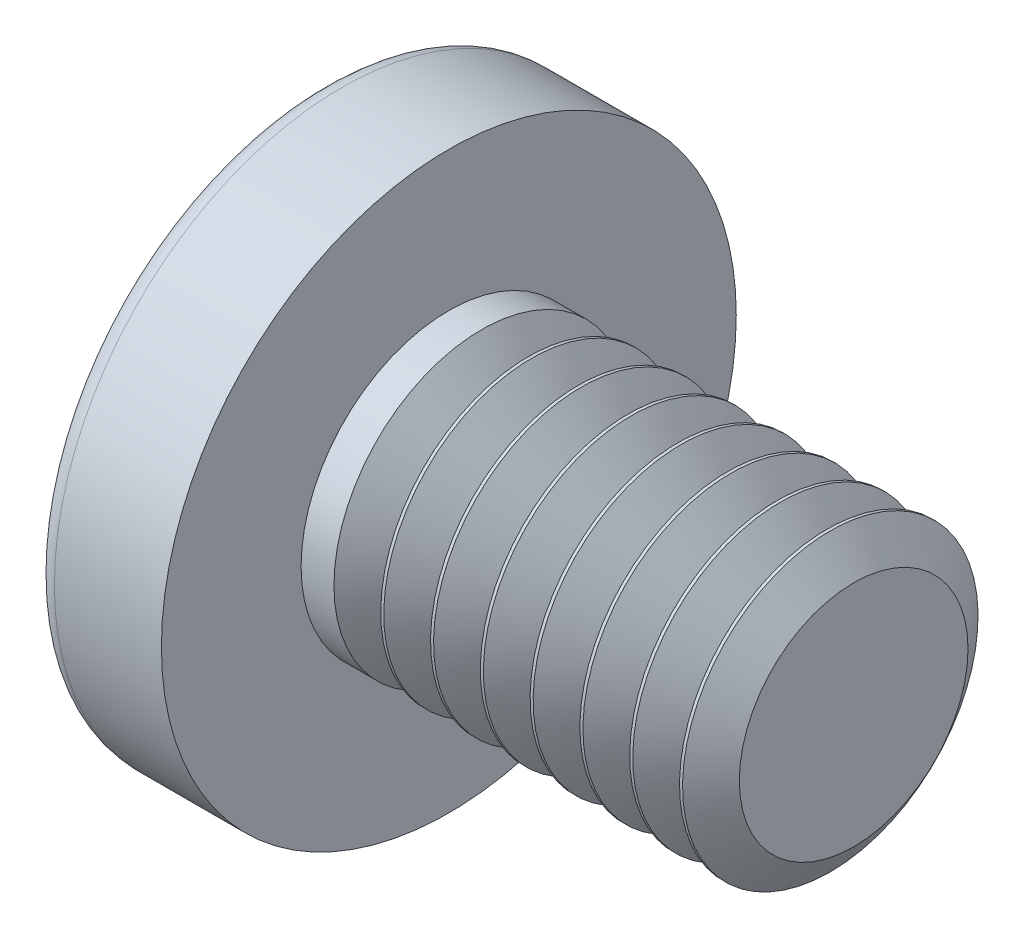
ISO-10303-21;
HEADER;
FILE_DESCRIPTION(('STEP AP214'),'2;1');
FILE_NAME('part.step','',(''),(''),'','','');
FILE_SCHEMA(('AUTOMOTIVE_DESIGN { 1 0 10303 214 1 1 1 1 }'));
ENDSEC;
DATA;
#1=APPLICATION_CONTEXT('core data for automotive mechanical design processes');
#2=APPLICATION_PROTOCOL_DEFINITION('international standard','automotive_design',2000,#1);
#3=PRODUCT_CONTEXT('',#1,'mechanical');
#4=PRODUCT('Part','Part','',(#3));
#5=PRODUCT_RELATED_PRODUCT_CATEGORY('part','',(#4));
#6=PRODUCT_DEFINITION_FORMATION('','',#4);
#7=PRODUCT_DEFINITION_CONTEXT('part definition',#1,'design');
#8=PRODUCT_DEFINITION('design','',#6,#7);
#9=PRODUCT_DEFINITION_SHAPE('','',#8);
#10=(LENGTH_UNIT() NAMED_UNIT(*) SI_UNIT(.MILLI.,.METRE.));
#11=(NAMED_UNIT(*) PLANE_ANGLE_UNIT() SI_UNIT($,.RADIAN.));
#12=(NAMED_UNIT(*) SI_UNIT($,.STERADIAN.) SOLID_ANGLE_UNIT());
#13=UNCERTAINTY_MEASURE_WITH_UNIT(LENGTH_MEASURE(1.E-05),#10,'distance_accuracy_value','');
#14=(GEOMETRIC_REPRESENTATION_CONTEXT(3) GLOBAL_UNCERTAINTY_ASSIGNED_CONTEXT((#13)) GLOBAL_UNIT_ASSIGNED_CONTEXT((#10,
#11,#12)) REPRESENTATION_CONTEXT('',''));
#15=CARTESIAN_POINT('',(0.,0.,0.));
#16=DIRECTION('',(0.,0.,1.));
#17=DIRECTION('',(1.,0.,0.));
#18=AXIS2_PLACEMENT_3D('',#15,#16,#17);
#19=CARTESIAN_POINT('',(2.96672,0.,0.));
#20=DIRECTION('',(-1.,0.,0.));
#21=DIRECTION('',(0.,1.,0.));
#22=AXIS2_PLACEMENT_3D('',#19,#20,#21);
#23=SPHERICAL_SURFACE('',#22,2.96672);
#24=CARTESIAN_POINT('',(0.572117822074756,0.,0.));
#25=DIRECTION('',(-1.,0.,0.));
#26=DIRECTION('',(0.,0.,1.));
#27=AXIS2_PLACEMENT_3D('',#24,#25,#26);
#28=CIRCLE('',#27,1.75137316636852);
#29=CARTESIAN_POINT('',(0.572117822074756,0.,1.75137316636852));
#30=VERTEX_POINT('',#29);
#31=EDGE_CURVE('E154',#30,#30,#28,.T.);
#32=ORIENTED_EDGE('',*,*,#31,.T.);
#33=EDGE_LOOP('',(#32));
#34=FACE_BOUND('',#33,.T.);
#35=CARTESIAN_POINT('',(2.95618230483271,-0.080788996282528,0.));
#36=DIRECTION('',(-0.129339184067768,-0.991600411186222,0.));
#37=DIRECTION('',(0.991600411186222,-0.129339184067768,0.));
#38=AXIS2_PLACEMENT_3D('',#35,#36,#37);
#39=CIRCLE('',#38,2.96560106107686);
#40=CARTESIAN_POINT('',(0.180443675996919,0.281263868348225,0.979276488567796));
#41=VERTEX_POINT('',#40);
#42=CARTESIAN_POINT('',(0.0306571954947119,0.300801235370254,0.300801235370255));
#43=VERTEX_POINT('',#42);
#44=EDGE_CURVE('E185',#41,#43,#39,.T.);
#45=ORIENTED_EDGE('',*,*,#44,.F.);
#46=CARTESIAN_POINT('',(2.30093540471062,0.,-0.795482893073021));
#47=DIRECTION('',(0.641822684198511,0.,0.766853077224195));
#48=DIRECTION('',(0.766853077224195,0.,-0.641822684198511));
#49=AXIS2_PLACEMENT_3D('',#46,#47,#48);
#50=CIRCLE('',#49,2.77945415466842);
#51=CARTESIAN_POINT('',(0.18044367599692,-0.281263868348231,0.979276488567795));
#52=VERTEX_POINT('',#51);
#53=EDGE_CURVE('E153',#41,#52,#50,.T.);
#54=ORIENTED_EDGE('',*,*,#53,.T.);
#55=CARTESIAN_POINT('',(2.95618230483271,0.0807889962825276,0.));
#56=DIRECTION('',(-0.129339184067768,0.991600411186222,0.));
#57=DIRECTION('',(-0.991600411186222,-0.129339184067768,0.));
#58=AXIS2_PLACEMENT_3D('',#55,#56,#57);
#59=CIRCLE('',#58,2.96560106107686);
#60=CARTESIAN_POINT('',(0.0306571954947119,-0.300801235370256,0.300801235370255));
#61=VERTEX_POINT('',#60);
#62=EDGE_CURVE('E109',#61,#52,#59,.T.);
#63=ORIENTED_EDGE('',*,*,#62,.F.);
#64=CARTESIAN_POINT('',(2.95618230483271,0.,-0.0807889962825276));
#65=DIRECTION('',(-0.129339184067768,0.,-0.991600411186222));
#66=DIRECTION('',(-0.991600411186222,0.,0.129339184067768));
#67=AXIS2_PLACEMENT_3D('',#64,#65,#66);
#68=CIRCLE('',#67,2.96560106107686);
#69=CARTESIAN_POINT('',(0.18044367599692,-0.979276488567796,0.281263868348228));
#70=VERTEX_POINT('',#69);
#71=EDGE_CURVE('E134',#70,#61,#68,.T.);
#72=ORIENTED_EDGE('',*,*,#71,.F.);
#73=CARTESIAN_POINT('',(2.30093540471062,0.795482893073021,0.));
#74=DIRECTION('',(0.641822684198511,-0.766853077224195,0.));
#75=DIRECTION('',(0.766853077224195,0.641822684198511,0.));
#76=AXIS2_PLACEMENT_3D('',#73,#74,#75);
#77=CIRCLE('',#76,2.77945415466842);
#78=CARTESIAN_POINT('',(0.18044367599692,-0.979276488567796,-0.281263868348228));
#79=VERTEX_POINT('',#78);
#80=EDGE_CURVE('E142',#70,#79,#77,.T.);
#81=ORIENTED_EDGE('',*,*,#80,.T.);
#82=CARTESIAN_POINT('',(2.95618230483271,0.,0.080788996282528));
#83=DIRECTION('',(-0.129339184067768,0.,0.991600411186222));
#84=DIRECTION('',(0.991600411186222,0.,0.129339184067768));
#85=AXIS2_PLACEMENT_3D('',#82,#83,#84);
#86=CIRCLE('',#85,2.96560106107686);
#87=CARTESIAN_POINT('',(0.0306571954947119,-0.300801235370254,-0.300801235370255));
#88=VERTEX_POINT('',#87);
#89=EDGE_CURVE('E52',#88,#79,#86,.T.);
#90=ORIENTED_EDGE('',*,*,#89,.F.);
#91=CARTESIAN_POINT('',(0.18044367599692,-0.281263868348224,-0.979276488567796));
#92=VERTEX_POINT('',#91);
#93=EDGE_CURVE('E192',#92,#88,#59,.T.);
#94=ORIENTED_EDGE('',*,*,#93,.F.);
#95=CARTESIAN_POINT('',(2.30093540471062,0.,0.795482893073021));
#96=DIRECTION('',(0.641822684198511,0.,-0.766853077224195));
#97=DIRECTION('',(-0.766853077224195,0.,-0.641822684198511));
#98=AXIS2_PLACEMENT_3D('',#95,#96,#97);
#99=CIRCLE('',#98,2.77945415466842);
#100=CARTESIAN_POINT('',(0.18044367599692,0.281263868348231,-0.979276488567795));
#101=VERTEX_POINT('',#100);
#102=EDGE_CURVE('E135',#92,#101,#99,.T.);
#103=ORIENTED_EDGE('',*,*,#102,.T.);
#104=CARTESIAN_POINT('',(0.0306571954947123,0.300801235370256,-0.300801235370255));
#105=VERTEX_POINT('',#104);
#106=EDGE_CURVE('E180',#105,#101,#39,.T.);
#107=ORIENTED_EDGE('',*,*,#106,.F.);
#108=CARTESIAN_POINT('',(0.18044367599692,0.979276488567795,-0.281263868348228));
#109=VERTEX_POINT('',#108);
#110=EDGE_CURVE('E45',#109,#105,#86,.T.);
#111=ORIENTED_EDGE('',*,*,#110,.F.);
#112=CARTESIAN_POINT('',(2.30093540471062,-0.795482893073022,0.));
#113=DIRECTION('',(0.641822684198511,0.766853077224195,0.));
#114=DIRECTION('',(-0.766853077224195,0.641822684198511,0.));
#115=AXIS2_PLACEMENT_3D('',#112,#113,#114);
#116=CIRCLE('',#115,2.77945415466842);
#117=CARTESIAN_POINT('',(0.18044367599692,0.979276488567795,0.281263868348228));
#118=VERTEX_POINT('',#117);
#119=EDGE_CURVE('E11',#109,#118,#116,.T.);
#120=ORIENTED_EDGE('',*,*,#119,.T.);
#121=EDGE_CURVE('E168',#43,#118,#68,.T.);
#122=ORIENTED_EDGE('',*,*,#121,.F.);
#123=EDGE_LOOP('',(#45,#54,#63,#72,#81,#90,#94,#103,#107,#111,#120,#122));
#124=FACE_BOUND('',#123,.T.);
#125=ADVANCED_FACE('F37',(#34,#124),#23,.T.);
#126=CARTESIAN_POINT('',(1.35048831168831,0.,-0.128649350649351));
#127=DIRECTION('',(-0.129339184067768,0.,0.991600411186222));
#128=DIRECTION('',(0.991600411186222,0.,0.129339184067768));
#129=AXIS2_PLACEMENT_3D('',#126,#127,#128);
#130=PLANE('',#129);
#131=ORIENTED_EDGE('',*,*,#110,.T.);
#132=DIRECTION('',(0.983408987060729,-0.128270737442704,0.128270737442704));
#133=VECTOR('',#132,1.);
#134=CARTESIAN_POINT('',(1.36671647475011,0.126532633728247,-0.126532633728246));
#135=LINE('',#134,#133);
#136=CARTESIAN_POINT('',(1.1684,0.152400000000001,-0.152399999999999));
#137=VERTEX_POINT('',#136);
#138=EDGE_CURVE('E174',#105,#137,#135,.T.);
#139=ORIENTED_EDGE('',*,*,#138,.T.);
#140=DIRECTION('',(0.763045494112351,-0.638635902680989,0.0995276731450893));
#141=VECTOR('',#140,1.);
#142=CARTESIAN_POINT('',(0.,1.1303,-0.3048));
#143=LINE('',#142,#141);
#144=EDGE_CURVE('E158',#109,#137,#143,.T.);
#145=ORIENTED_EDGE('',*,*,#144,.F.);
#146=EDGE_LOOP('',(#131,#139,#145));
#147=FACE_BOUND('',#146,.T.);
#148=ADVANCED_FACE('F173',(#147),#130,.T.);
#149=DIRECTION('',(0.763045494112351,0.638635902680989,0.0995276731450893));
#150=VECTOR('',#149,1.);
#151=CARTESIAN_POINT('',(0.,-1.1303,-0.3048));
#152=LINE('',#151,#150);
#153=CARTESIAN_POINT('',(1.1684,-0.1524,-0.1524));
#154=VERTEX_POINT('',#153);
#155=EDGE_CURVE('E143',#79,#154,#152,.T.);
#156=ORIENTED_EDGE('',*,*,#155,.T.);
#157=DIRECTION('',(-0.983408987060729,-0.128270737442703,-0.128270737442704));
#158=VECTOR('',#157,1.);
#159=CARTESIAN_POINT('',(1.36671647475011,-0.126532633728246,-0.126532633728246));
#160=LINE('',#159,#158);
#161=EDGE_CURVE('E195',#154,#88,#160,.T.);
#162=ORIENTED_EDGE('',*,*,#161,.T.);
#163=ORIENTED_EDGE('',*,*,#89,.T.);
#164=EDGE_LOOP('',(#156,#162,#163));
#165=FACE_BOUND('',#164,.T.);
#166=ADVANCED_FACE('F292',(#165),#130,.T.);
#167=CARTESIAN_POINT('',(1.35048831168831,0.,0.128649350649351));
#168=DIRECTION('',(-0.129339184067768,0.,-0.991600411186222));
#169=DIRECTION('',(-0.991600411186222,0.,0.129339184067768));
#170=AXIS2_PLACEMENT_3D('',#167,#168,#169);
#171=PLANE('',#170);
#172=DIRECTION('',(0.763045494112351,-0.638635902680989,-0.0995276731450892));
#173=VECTOR('',#172,1.);
#174=CARTESIAN_POINT('',(0.,1.1303,0.3048));
#175=LINE('',#174,#173);
#176=CARTESIAN_POINT('',(1.1684,0.1524,0.1524));
#177=VERTEX_POINT('',#176);
#178=EDGE_CURVE('E757',#118,#177,#175,.T.);
#179=ORIENTED_EDGE('',*,*,#178,.T.);
#180=DIRECTION('',(-0.983408987060729,0.128270737442703,0.128270737442704));
#181=VECTOR('',#180,1.);
#182=CARTESIAN_POINT('',(1.36671647475011,0.126532633728246,0.126532633728246));
#183=LINE('',#182,#181);
#184=EDGE_CURVE('E189',#177,#43,#183,.T.);
#185=ORIENTED_EDGE('',*,*,#184,.T.);
#186=ORIENTED_EDGE('',*,*,#121,.T.);
#187=EDGE_LOOP('',(#179,#185,#186));
#188=FACE_BOUND('',#187,.T.);
#189=ADVANCED_FACE('F322',(#188),#171,.T.);
#190=ORIENTED_EDGE('',*,*,#71,.T.);
#191=DIRECTION('',(0.983408987060729,0.128270737442704,-0.128270737442704));
#192=VECTOR('',#191,1.);
#193=CARTESIAN_POINT('',(1.36671647475011,-0.126532633728247,0.126532633728246));
#194=LINE('',#193,#192);
#195=CARTESIAN_POINT('',(1.1684,-0.152400000000001,0.152399999999999));
#196=VERTEX_POINT('',#195);
#197=EDGE_CURVE('E107',#61,#196,#194,.T.);
#198=ORIENTED_EDGE('',*,*,#197,.T.);
#199=DIRECTION('',(0.763045494112351,0.638635902680989,-0.099527673145089));
#200=VECTOR('',#199,1.);
#201=CARTESIAN_POINT('',(0.,-1.1303,0.3048));
#202=LINE('',#201,#200);
#203=EDGE_CURVE('E132',#70,#196,#202,.T.);
#204=ORIENTED_EDGE('',*,*,#203,.F.);
#205=EDGE_LOOP('',(#190,#198,#204));
#206=FACE_BOUND('',#205,.T.);
#207=ADVANCED_FACE('F131',(#206),#171,.T.);
#208=CARTESIAN_POINT('',(-25.4,0.,0.));
#209=DIRECTION('',(-1.,0.,0.));
#210=DIRECTION('',(0.,0.,1.));
#211=AXIS2_PLACEMENT_3D('',#208,#209,#210);
#212=CYLINDRICAL_SURFACE('',#211,0.9271);
#213=CARTESIAN_POINT('',(1.55253151036815,0.,0.));
#214=DIRECTION('',(-1.,0.,0.));
#215=DIRECTION('',(0.,-1.,0.));
#216=AXIS2_PLACEMENT_3D('',#213,#214,#215);
#217=CIRCLE('',#216,0.9271);
#218=CARTESIAN_POINT('',(1.55253151036815,-0.9271,0.));
#219=VERTEX_POINT('',#218);
#220=EDGE_CURVE('E207',#219,#219,#217,.T.);
#221=ORIENTED_EDGE('',*,*,#220,.T.);
#222=EDGE_LOOP('',(#221));
#223=FACE_BOUND('',#222,.T.);
#224=CARTESIAN_POINT('',(1.3462,0.,0.));
#225=DIRECTION('',(-1.,0.,0.));
#226=DIRECTION('',(0.,0.,1.));
#227=AXIS2_PLACEMENT_3D('',#224,#225,#226);
#228=CIRCLE('',#227,0.9271);
#229=CARTESIAN_POINT('',(1.3462,0.,0.9271));
#230=VERTEX_POINT('',#229);
#231=EDGE_CURVE('E164',#230,#230,#228,.T.);
#232=ORIENTED_EDGE('',*,*,#231,.F.);
#233=EDGE_LOOP('',(#232));
#234=FACE_BOUND('',#233,.T.);
#235=ADVANCED_FACE('F39',(#223,#234),#212,.T.);
#236=CARTESIAN_POINT('',(1.3462,0.9271,0.));
#237=DIRECTION('',(-1.,0.,0.));
#238=DIRECTION('',(0.,0.,1.));
#239=AXIS2_PLACEMENT_3D('',#236,#237,#238);
#240=PLANE('',#239);
#241=CARTESIAN_POINT('',(1.3462,0.,0.));
#242=DIRECTION('',(-1.,0.,0.));
#243=DIRECTION('',(0.,0.,1.));
#244=AXIS2_PLACEMENT_3D('',#241,#242,#243);
#245=CIRCLE('',#244,1.8034);
#246=CARTESIAN_POINT('',(1.3462,0.,1.8034));
#247=VERTEX_POINT('',#246);
#248=EDGE_CURVE('E161',#247,#247,#245,.T.);
#249=ORIENTED_EDGE('',*,*,#248,.F.);
#250=EDGE_LOOP('',(#249));
#251=FACE_BOUND('',#250,.T.);
#252=ORIENTED_EDGE('',*,*,#231,.T.);
#253=EDGE_LOOP('',(#252));
#254=FACE_BOUND('',#253,.T.);
#255=ADVANCED_FACE('F302',(#251,#254),#240,.F.);
#256=CARTESIAN_POINT('',(-25.4,0.,0.));
#257=DIRECTION('',(-1.,0.,0.));
#258=DIRECTION('',(0.,0.,1.));
#259=AXIS2_PLACEMENT_3D('',#256,#257,#258);
#260=CYLINDRICAL_SURFACE('',#259,1.8034);
#261=ORIENTED_EDGE('',*,*,#248,.T.);
#262=EDGE_LOOP('',(#261));
#263=FACE_BOUND('',#262,.T.);
#264=CARTESIAN_POINT('',(0.674626476951691,0.,0.));
#265=DIRECTION('',(-1.,0.,0.));
#266=DIRECTION('',(0.,0.,1.));
#267=AXIS2_PLACEMENT_3D('',#264,#265,#266);
#268=CIRCLE('',#267,1.8034);
#269=CARTESIAN_POINT('',(0.674626476951691,0.,1.8034));
#270=VERTEX_POINT('',#269);
#271=EDGE_CURVE('E157',#270,#270,#268,.T.);
#272=ORIENTED_EDGE('',*,*,#271,.F.);
#273=EDGE_LOOP('',(#272));
#274=FACE_BOUND('',#273,.T.);
#275=ADVANCED_FACE('F299',(#263,#274),#260,.T.);
#276=CARTESIAN_POINT('',(0.674626476951693,0.,0.));
#277=DIRECTION('',(-1.,0.,0.));
#278=DIRECTION('',(0.,0.,1.));
#279=AXIS2_PLACEMENT_3D('',#276,#277,#278);
#280=TOROIDAL_SURFACE('',#279,1.6764,0.127);
#281=ORIENTED_EDGE('',*,*,#271,.T.);
#282=EDGE_LOOP('',(#281));
#283=FACE_BOUND('',#282,.T.);
#284=ORIENTED_EDGE('',*,*,#31,.F.);
#285=EDGE_LOOP('',(#284));
#286=FACE_BOUND('',#285,.T.);
#287=ADVANCED_FACE('F295',(#283,#286),#280,.T.);
#288=CARTESIAN_POINT('',(1.1684,0.1524,0.1524));
#289=DIRECTION('',(0.641822684198511,0.766853077224195,0.));
#290=DIRECTION('',(-0.766853077224195,0.641822684198511,0.));
#291=AXIS2_PLACEMENT_3D('',#288,#289,#290);
#292=PLANE('',#291);
#293=ORIENTED_EDGE('',*,*,#144,.T.);
#294=DIRECTION('',(0.,0.,-1.));
#295=VECTOR('',#294,1.);
#296=CARTESIAN_POINT('',(1.1684,0.1524,0.1524));
#297=LINE('',#296,#295);
#298=EDGE_CURVE('E125',#177,#137,#297,.T.);
#299=ORIENTED_EDGE('',*,*,#298,.F.);
#300=ORIENTED_EDGE('',*,*,#178,.F.);
#301=ORIENTED_EDGE('',*,*,#119,.F.);
#302=EDGE_LOOP('',(#293,#299,#300,#301));
#303=FACE_BOUND('',#302,.T.);
#304=ADVANCED_FACE('F298',(#303),#292,.F.);
#305=CARTESIAN_POINT('',(1.1684,-0.1524,-0.1524));
#306=DIRECTION('',(0.641822684198511,-0.766853077224195,0.));
#307=DIRECTION('',(0.766853077224195,0.641822684198511,0.));
#308=AXIS2_PLACEMENT_3D('',#305,#306,#307);
#309=PLANE('',#308);
#310=ORIENTED_EDGE('',*,*,#203,.T.);
#311=DIRECTION('',(0.,0.,1.));
#312=VECTOR('',#311,1.);
#313=CARTESIAN_POINT('',(1.1684,-0.1524,-0.1524));
#314=LINE('',#313,#312);
#315=EDGE_CURVE('E124',#154,#196,#314,.T.);
#316=ORIENTED_EDGE('',*,*,#315,.F.);
#317=ORIENTED_EDGE('',*,*,#155,.F.);
#318=ORIENTED_EDGE('',*,*,#80,.F.);
#319=EDGE_LOOP('',(#310,#316,#317,#318));
#320=FACE_BOUND('',#319,.T.);
#321=ADVANCED_FACE('F139',(#320),#309,.F.);
#322=CARTESIAN_POINT('',(1.1684,0.1524,-0.1524));
#323=DIRECTION('',(-1.,0.,0.));
#324=DIRECTION('',(0.,0.,1.));
#325=AXIS2_PLACEMENT_3D('',#322,#323,#324);
#326=PLANE('',#325);
#327=DIRECTION('',(0.,1.,0.));
#328=VECTOR('',#327,1.);
#329=CARTESIAN_POINT('',(1.1684,-0.1524,-0.1524));
#330=LINE('',#329,#328);
#331=EDGE_CURVE('E147',#154,#137,#330,.T.);
#332=ORIENTED_EDGE('',*,*,#331,.F.);
#333=ORIENTED_EDGE('',*,*,#315,.T.);
#334=DIRECTION('',(0.,-1.,0.));
#335=VECTOR('',#334,1.);
#336=CARTESIAN_POINT('',(1.1684,0.1524,0.1524));
#337=LINE('',#336,#335);
#338=EDGE_CURVE('E116',#177,#196,#337,.T.);
#339=ORIENTED_EDGE('',*,*,#338,.F.);
#340=ORIENTED_EDGE('',*,*,#298,.T.);
#341=EDGE_LOOP('',(#332,#333,#339,#340));
#342=FACE_BOUND('',#341,.T.);
#343=ADVANCED_FACE('F145',(#342),#326,.T.);
#344=CARTESIAN_POINT('',(1.1684,0.152400000000001,-0.152399999999999));
#345=DIRECTION('',(0.641822684198511,0.,-0.766853077224195));
#346=DIRECTION('',(0.766853077224195,0.,0.641822684198511));
#347=AXIS2_PLACEMENT_3D('',#344,#345,#346);
#348=PLANE('',#347);
#349=DIRECTION('',(0.763045494112351,0.0995276731450868,0.63863590268099));
#350=VECTOR('',#349,1.);
#351=CARTESIAN_POINT('',(0.,-0.304799999999996,-1.1303));
#352=LINE('',#351,#350);
#353=EDGE_CURVE('E200',#92,#154,#352,.T.);
#354=ORIENTED_EDGE('',*,*,#353,.T.);
#355=ORIENTED_EDGE('',*,*,#331,.T.);
#356=DIRECTION('',(0.763045494112351,-0.0995276731450915,0.638635902680989));
#357=VECTOR('',#356,1.);
#358=CARTESIAN_POINT('',(0.,0.304800000000004,-1.1303));
#359=LINE('',#358,#357);
#360=EDGE_CURVE('E113',#101,#137,#359,.T.);
#361=ORIENTED_EDGE('',*,*,#360,.F.);
#362=ORIENTED_EDGE('',*,*,#102,.F.);
#363=EDGE_LOOP('',(#354,#355,#361,#362));
#364=FACE_BOUND('',#363,.T.);
#365=ADVANCED_FACE('F437',(#364),#348,.F.);
#366=CARTESIAN_POINT('',(1.35048831168831,-0.128649350649351,0.));
#367=DIRECTION('',(-0.129339184067768,0.991600411186222,0.));
#368=DIRECTION('',(-0.991600411186222,-0.129339184067768,0.));
#369=AXIS2_PLACEMENT_3D('',#366,#367,#368);
#370=PLANE('',#369);
#371=ORIENTED_EDGE('',*,*,#93,.T.);
#372=ORIENTED_EDGE('',*,*,#161,.F.);
#373=ORIENTED_EDGE('',*,*,#353,.F.);
#374=EDGE_LOOP('',(#371,#372,#373));
#375=FACE_BOUND('',#374,.T.);
#376=ADVANCED_FACE('F434',(#375),#370,.T.);
#377=CARTESIAN_POINT('',(1.35048831168831,0.128649350649351,0.));
#378=DIRECTION('',(-0.129339184067768,-0.991600411186222,0.));
#379=DIRECTION('',(0.991600411186222,-0.129339184067768,0.));
#380=AXIS2_PLACEMENT_3D('',#377,#378,#379);
#381=PLANE('',#380);
#382=ORIENTED_EDGE('',*,*,#106,.T.);
#383=ORIENTED_EDGE('',*,*,#360,.T.);
#384=ORIENTED_EDGE('',*,*,#138,.F.);
#385=EDGE_LOOP('',(#382,#383,#384));
#386=FACE_BOUND('',#385,.T.);
#387=ADVANCED_FACE('F431',(#386),#381,.T.);
#388=CARTESIAN_POINT('',(1.1684,-0.152400000000001,0.152399999999999));
#389=DIRECTION('',(0.641822684198511,0.,0.766853077224195));
#390=DIRECTION('',(-0.766853077224195,0.,0.641822684198511));
#391=AXIS2_PLACEMENT_3D('',#388,#389,#390);
#392=PLANE('',#391);
#393=DIRECTION('',(0.763045494112351,-0.0995276731450871,-0.63863590268099));
#394=VECTOR('',#393,1.);
#395=CARTESIAN_POINT('',(0.,0.304799999999996,1.1303));
#396=LINE('',#395,#394);
#397=EDGE_CURVE('E112',#41,#177,#396,.T.);
#398=ORIENTED_EDGE('',*,*,#397,.T.);
#399=ORIENTED_EDGE('',*,*,#338,.T.);
#400=DIRECTION('',(0.763045494112351,0.0995276731450914,-0.638635902680989));
#401=VECTOR('',#400,1.);
#402=CARTESIAN_POINT('',(0.,-0.304800000000004,1.1303));
#403=LINE('',#402,#401);
#404=EDGE_CURVE('E103',#52,#196,#403,.T.);
#405=ORIENTED_EDGE('',*,*,#404,.F.);
#406=ORIENTED_EDGE('',*,*,#53,.F.);
#407=EDGE_LOOP('',(#398,#399,#405,#406));
#408=FACE_BOUND('',#407,.T.);
#409=ADVANCED_FACE('F117',(#408),#392,.F.);
#410=ORIENTED_EDGE('',*,*,#44,.T.);
#411=ORIENTED_EDGE('',*,*,#184,.F.);
#412=ORIENTED_EDGE('',*,*,#397,.F.);
#413=EDGE_LOOP('',(#410,#411,#412));
#414=FACE_BOUND('',#413,.T.);
#415=ADVANCED_FACE('F430',(#414),#381,.T.);
#416=ORIENTED_EDGE('',*,*,#62,.T.);
#417=ORIENTED_EDGE('',*,*,#404,.T.);
#418=ORIENTED_EDGE('',*,*,#197,.F.);
#419=EDGE_LOOP('',(#416,#417,#418));
#420=FACE_BOUND('',#419,.T.);
#421=ADVANCED_FACE('F105',(#420),#370,.T.);
#422=CARTESIAN_POINT('',(1.84598848963184,0.,0.));
#423=DIRECTION('',(1.,0.,0.));
#424=DIRECTION('',(0.,1.,0.));
#425=AXIS2_PLACEMENT_3D('',#422,#423,#424);
#426=CONICAL_SURFACE('',#425,0.927100000000001,0.959931088596883);
#427=CARTESIAN_POINT('',(1.69926,0.,0.));
#428=DIRECTION('',(-1.,0.,0.));
#429=DIRECTION('',(0.,-1.,0.));
#430=AXIS2_PLACEMENT_3D('',#427,#428,#429);
#431=CIRCLE('',#430,0.717550000000001);
#432=CARTESIAN_POINT('',(1.69926,-0.71755,0.));
#433=VERTEX_POINT('',#432);
#434=EDGE_CURVE('E210',#433,#433,#431,.T.);
#435=ORIENTED_EDGE('',*,*,#434,.F.);
#436=EDGE_LOOP('',(#435));
#437=FACE_BOUND('',#436,.T.);
#438=CARTESIAN_POINT('',(1.84598848963184,0.,0.));
#439=DIRECTION('',(-1.,0.,0.));
#440=DIRECTION('',(0.,-1.,0.));
#441=AXIS2_PLACEMENT_3D('',#438,#439,#440);
#442=CIRCLE('',#441,0.927100000000001);
#443=CARTESIAN_POINT('',(1.84598848963184,-0.9271,0.));
#444=VERTEX_POINT('',#443);
#445=EDGE_CURVE('E202',#444,#444,#442,.T.);
#446=ORIENTED_EDGE('',*,*,#445,.T.);
#447=EDGE_LOOP('',(#446));
#448=FACE_BOUND('',#447,.T.);
#449=ADVANCED_FACE('F340',(#437,#448),#426,.T.);
#450=CARTESIAN_POINT('',(1.69926,0.,0.));
#451=DIRECTION('',(-1.,0.,0.));
#452=DIRECTION('',(0.,-1.,0.));
#453=AXIS2_PLACEMENT_3D('',#450,#451,#452);
#454=CONICAL_SURFACE('',#453,0.717550000000001,0.959931088596876);
#455=ORIENTED_EDGE('',*,*,#220,.F.);
#456=EDGE_LOOP('',(#455));
#457=FACE_BOUND('',#456,.T.);
#458=ORIENTED_EDGE('',*,*,#434,.T.);
#459=EDGE_LOOP('',(#458));
#460=FACE_BOUND('',#459,.T.);
#461=ADVANCED_FACE('F330',(#457,#460),#454,.T.);
#462=CARTESIAN_POINT('',(1.86495151036815,0.,0.));
#463=DIRECTION('',(-1.,0.,0.));
#464=DIRECTION('',(0.,-1.,0.));
#465=AXIS2_PLACEMENT_3D('',#462,#463,#464);
#466=CIRCLE('',#465,0.9271);
#467=CARTESIAN_POINT('',(1.86495151036815,-0.9271,0.));
#468=VERTEX_POINT('',#467);
#469=EDGE_CURVE('E216',#468,#468,#466,.T.);
#470=ORIENTED_EDGE('',*,*,#469,.T.);
#471=EDGE_LOOP('',(#470));
#472=FACE_BOUND('',#471,.T.);
#473=ORIENTED_EDGE('',*,*,#445,.F.);
#474=EDGE_LOOP('',(#473));
#475=FACE_BOUND('',#474,.T.);
#476=ADVANCED_FACE('F310',(#472,#475),#212,.T.);
#477=CARTESIAN_POINT('',(2.15840848963184,0.,0.));
#478=DIRECTION('',(1.,0.,0.));
#479=DIRECTION('',(0.,1.,0.));
#480=AXIS2_PLACEMENT_3D('',#477,#478,#479);
#481=CONICAL_SURFACE('',#480,0.927100000000001,0.959931088596883);
#482=CARTESIAN_POINT('',(2.01168,0.,0.));
#483=DIRECTION('',(-1.,0.,0.));
#484=DIRECTION('',(0.,-1.,0.));
#485=AXIS2_PLACEMENT_3D('',#482,#483,#484);
#486=CIRCLE('',#485,0.717550000000001);
#487=CARTESIAN_POINT('',(2.01168,-0.71755,0.));
#488=VERTEX_POINT('',#487);
#489=EDGE_CURVE('E219',#488,#488,#486,.T.);
#490=ORIENTED_EDGE('',*,*,#489,.F.);
#491=EDGE_LOOP('',(#490));
#492=FACE_BOUND('',#491,.T.);
#493=CARTESIAN_POINT('',(2.15840848963184,0.,0.));
#494=DIRECTION('',(-1.,0.,0.));
#495=DIRECTION('',(0.,-1.,0.));
#496=AXIS2_PLACEMENT_3D('',#493,#494,#495);
#497=CIRCLE('',#496,0.927100000000001);
#498=CARTESIAN_POINT('',(2.15840848963184,-0.9271,0.));
#499=VERTEX_POINT('',#498);
#500=EDGE_CURVE('E213',#499,#499,#497,.T.);
#501=ORIENTED_EDGE('',*,*,#500,.T.);
#502=EDGE_LOOP('',(#501));
#503=FACE_BOUND('',#502,.T.);
#504=ADVANCED_FACE('F329',(#492,#503),#481,.T.);
#505=CARTESIAN_POINT('',(2.01168,0.,0.));
#506=DIRECTION('',(-1.,0.,0.));
#507=DIRECTION('',(0.,-1.,0.));
#508=AXIS2_PLACEMENT_3D('',#505,#506,#507);
#509=CONICAL_SURFACE('',#508,0.717550000000001,0.959931088596876);
#510=ORIENTED_EDGE('',*,*,#469,.F.);
#511=EDGE_LOOP('',(#510));
#512=FACE_BOUND('',#511,.T.);
#513=ORIENTED_EDGE('',*,*,#489,.T.);
#514=EDGE_LOOP('',(#513));
#515=FACE_BOUND('',#514,.T.);
#516=ADVANCED_FACE('F337',(#512,#515),#509,.T.);
#517=CARTESIAN_POINT('',(2.17737151036815,0.,0.));
#518=DIRECTION('',(-1.,0.,0.));
#519=DIRECTION('',(0.,-1.,0.));
#520=AXIS2_PLACEMENT_3D('',#517,#518,#519);
#521=CIRCLE('',#520,0.9271);
#522=CARTESIAN_POINT('',(2.17737151036815,-0.9271,0.));
#523=VERTEX_POINT('',#522);
#524=EDGE_CURVE('E225',#523,#523,#521,.T.);
#525=ORIENTED_EDGE('',*,*,#524,.T.);
#526=EDGE_LOOP('',(#525));
#527=FACE_BOUND('',#526,.T.);
#528=ORIENTED_EDGE('',*,*,#500,.F.);
#529=EDGE_LOOP('',(#528));
#530=FACE_BOUND('',#529,.T.);
#531=ADVANCED_FACE('F332',(#527,#530),#212,.T.);
#532=CARTESIAN_POINT('',(2.47082848963184,0.,0.));
#533=DIRECTION('',(1.,0.,0.));
#534=DIRECTION('',(0.,1.,0.));
#535=AXIS2_PLACEMENT_3D('',#532,#533,#534);
#536=CONICAL_SURFACE('',#535,0.927100000000001,0.959931088596883);
#537=CARTESIAN_POINT('',(2.3241,0.,0.));
#538=DIRECTION('',(-1.,0.,0.));
#539=DIRECTION('',(0.,-1.,0.));
#540=AXIS2_PLACEMENT_3D('',#537,#538,#539);
#541=CIRCLE('',#540,0.717550000000001);
#542=CARTESIAN_POINT('',(2.3241,-0.71755,0.));
#543=VERTEX_POINT('',#542);
#544=EDGE_CURVE('E228',#543,#543,#541,.T.);
#545=ORIENTED_EDGE('',*,*,#544,.F.);
#546=EDGE_LOOP('',(#545));
#547=FACE_BOUND('',#546,.T.);
#548=CARTESIAN_POINT('',(2.47082848963184,0.,0.));
#549=DIRECTION('',(-1.,0.,0.));
#550=DIRECTION('',(0.,-1.,0.));
#551=AXIS2_PLACEMENT_3D('',#548,#549,#550);
#552=CIRCLE('',#551,0.927100000000001);
#553=CARTESIAN_POINT('',(2.47082848963184,-0.9271,0.));
#554=VERTEX_POINT('',#553);
#555=EDGE_CURVE('E222',#554,#554,#552,.T.);
#556=ORIENTED_EDGE('',*,*,#555,.T.);
#557=EDGE_LOOP('',(#556));
#558=FACE_BOUND('',#557,.T.);
#559=ADVANCED_FACE('F345',(#547,#558),#536,.T.);
#560=CARTESIAN_POINT('',(2.3241,0.,0.));
#561=DIRECTION('',(-1.,0.,0.));
#562=DIRECTION('',(0.,-1.,0.));
#563=AXIS2_PLACEMENT_3D('',#560,#561,#562);
#564=CONICAL_SURFACE('',#563,0.717550000000001,0.959931088596876);
#565=ORIENTED_EDGE('',*,*,#524,.F.);
#566=EDGE_LOOP('',(#565));
#567=FACE_BOUND('',#566,.T.);
#568=ORIENTED_EDGE('',*,*,#544,.T.);
#569=EDGE_LOOP('',(#568));
#570=FACE_BOUND('',#569,.T.);
#571=ADVANCED_FACE('F352',(#567,#570),#564,.T.);
#572=CARTESIAN_POINT('',(2.48979151036815,0.,0.));
#573=DIRECTION('',(-1.,0.,0.));
#574=DIRECTION('',(0.,-1.,0.));
#575=AXIS2_PLACEMENT_3D('',#572,#573,#574);
#576=CIRCLE('',#575,0.9271);
#577=CARTESIAN_POINT('',(2.48979151036815,-0.9271,0.));
#578=VERTEX_POINT('',#577);
#579=EDGE_CURVE('E234',#578,#578,#576,.T.);
#580=ORIENTED_EDGE('',*,*,#579,.T.);
#581=EDGE_LOOP('',(#580));
#582=FACE_BOUND('',#581,.T.);
#583=ORIENTED_EDGE('',*,*,#555,.F.);
#584=EDGE_LOOP('',(#583));
#585=FACE_BOUND('',#584,.T.);
#586=ADVANCED_FACE('F347',(#582,#585),#212,.T.);
#587=CARTESIAN_POINT('',(2.78324848963184,0.,0.));
#588=DIRECTION('',(1.,0.,0.));
#589=DIRECTION('',(0.,1.,0.));
#590=AXIS2_PLACEMENT_3D('',#587,#588,#589);
#591=CONICAL_SURFACE('',#590,0.927100000000001,0.959931088596883);
#592=CARTESIAN_POINT('',(2.63652,0.,0.));
#593=DIRECTION('',(-1.,0.,0.));
#594=DIRECTION('',(0.,-1.,0.));
#595=AXIS2_PLACEMENT_3D('',#592,#593,#594);
#596=CIRCLE('',#595,0.717550000000001);
#597=CARTESIAN_POINT('',(2.63652,-0.71755,0.));
#598=VERTEX_POINT('',#597);
#599=EDGE_CURVE('E237',#598,#598,#596,.T.);
#600=ORIENTED_EDGE('',*,*,#599,.F.);
#601=EDGE_LOOP('',(#600));
#602=FACE_BOUND('',#601,.T.);
#603=CARTESIAN_POINT('',(2.78324848963184,0.,0.));
#604=DIRECTION('',(-1.,0.,0.));
#605=DIRECTION('',(0.,-1.,0.));
#606=AXIS2_PLACEMENT_3D('',#603,#604,#605);
#607=CIRCLE('',#606,0.927100000000001);
#608=CARTESIAN_POINT('',(2.78324848963184,-0.9271,0.));
#609=VERTEX_POINT('',#608);
#610=EDGE_CURVE('E231',#609,#609,#607,.T.);
#611=ORIENTED_EDGE('',*,*,#610,.T.);
#612=EDGE_LOOP('',(#611));
#613=FACE_BOUND('',#612,.T.);
#614=ADVANCED_FACE('F359',(#602,#613),#591,.T.);
#615=CARTESIAN_POINT('',(2.63652,0.,0.));
#616=DIRECTION('',(-1.,0.,0.));
#617=DIRECTION('',(0.,-1.,0.));
#618=AXIS2_PLACEMENT_3D('',#615,#616,#617);
#619=CONICAL_SURFACE('',#618,0.717550000000001,0.959931088596876);
#620=ORIENTED_EDGE('',*,*,#579,.F.);
#621=EDGE_LOOP('',(#620));
#622=FACE_BOUND('',#621,.T.);
#623=ORIENTED_EDGE('',*,*,#599,.T.);
#624=EDGE_LOOP('',(#623));
#625=FACE_BOUND('',#624,.T.);
#626=ADVANCED_FACE('F366',(#622,#625),#619,.T.);
#627=CARTESIAN_POINT('',(2.80221151036815,0.,0.));
#628=DIRECTION('',(-1.,0.,0.));
#629=DIRECTION('',(0.,-1.,0.));
#630=AXIS2_PLACEMENT_3D('',#627,#628,#629);
#631=CIRCLE('',#630,0.9271);
#632=CARTESIAN_POINT('',(2.80221151036815,-0.9271,0.));
#633=VERTEX_POINT('',#632);
#634=EDGE_CURVE('E243',#633,#633,#631,.T.);
#635=ORIENTED_EDGE('',*,*,#634,.T.);
#636=EDGE_LOOP('',(#635));
#637=FACE_BOUND('',#636,.T.);
#638=ORIENTED_EDGE('',*,*,#610,.F.);
#639=EDGE_LOOP('',(#638));
#640=FACE_BOUND('',#639,.T.);
#641=ADVANCED_FACE('F361',(#637,#640),#212,.T.);
#642=CARTESIAN_POINT('',(3.09566848963184,0.,0.));
#643=DIRECTION('',(1.,0.,0.));
#644=DIRECTION('',(0.,1.,0.));
#645=AXIS2_PLACEMENT_3D('',#642,#643,#644);
#646=CONICAL_SURFACE('',#645,0.927100000000001,0.959931088596883);
#647=CARTESIAN_POINT('',(2.94894,0.,0.));
#648=DIRECTION('',(-1.,0.,0.));
#649=DIRECTION('',(0.,-1.,0.));
#650=AXIS2_PLACEMENT_3D('',#647,#648,#649);
#651=CIRCLE('',#650,0.717550000000001);
#652=CARTESIAN_POINT('',(2.94894,-0.71755,0.));
#653=VERTEX_POINT('',#652);
#654=EDGE_CURVE('E246',#653,#653,#651,.T.);
#655=ORIENTED_EDGE('',*,*,#654,.F.);
#656=EDGE_LOOP('',(#655));
#657=FACE_BOUND('',#656,.T.);
#658=CARTESIAN_POINT('',(3.09566848963184,0.,0.));
#659=DIRECTION('',(-1.,0.,0.));
#660=DIRECTION('',(0.,-1.,0.));
#661=AXIS2_PLACEMENT_3D('',#658,#659,#660);
#662=CIRCLE('',#661,0.927100000000001);
#663=CARTESIAN_POINT('',(3.09566848963184,-0.9271,0.));
#664=VERTEX_POINT('',#663);
#665=EDGE_CURVE('E240',#664,#664,#662,.T.);
#666=ORIENTED_EDGE('',*,*,#665,.T.);
#667=EDGE_LOOP('',(#666));
#668=FACE_BOUND('',#667,.T.);
#669=ADVANCED_FACE('F373',(#657,#668),#646,.T.);
#670=CARTESIAN_POINT('',(2.94894,0.,0.));
#671=DIRECTION('',(-1.,0.,0.));
#672=DIRECTION('',(0.,-1.,0.));
#673=AXIS2_PLACEMENT_3D('',#670,#671,#672);
#674=CONICAL_SURFACE('',#673,0.717550000000001,0.959931088596876);
#675=ORIENTED_EDGE('',*,*,#634,.F.);
#676=EDGE_LOOP('',(#675));
#677=FACE_BOUND('',#676,.T.);
#678=ORIENTED_EDGE('',*,*,#654,.T.);
#679=EDGE_LOOP('',(#678));
#680=FACE_BOUND('',#679,.T.);
#681=ADVANCED_FACE('F380',(#677,#680),#674,.T.);
#682=CARTESIAN_POINT('',(3.11463151036815,0.,0.));
#683=DIRECTION('',(-1.,0.,0.));
#684=DIRECTION('',(0.,-1.,0.));
#685=AXIS2_PLACEMENT_3D('',#682,#683,#684);
#686=CIRCLE('',#685,0.9271);
#687=CARTESIAN_POINT('',(3.11463151036815,-0.9271,0.));
#688=VERTEX_POINT('',#687);
#689=EDGE_CURVE('E252',#688,#688,#686,.T.);
#690=ORIENTED_EDGE('',*,*,#689,.T.);
#691=EDGE_LOOP('',(#690));
#692=FACE_BOUND('',#691,.T.);
#693=ORIENTED_EDGE('',*,*,#665,.F.);
#694=EDGE_LOOP('',(#693));
#695=FACE_BOUND('',#694,.T.);
#696=ADVANCED_FACE('F375',(#692,#695),#212,.T.);
#697=CARTESIAN_POINT('',(3.40808848963184,0.,0.));
#698=DIRECTION('',(1.,0.,0.));
#699=DIRECTION('',(0.,1.,0.));
#700=AXIS2_PLACEMENT_3D('',#697,#698,#699);
#701=CONICAL_SURFACE('',#700,0.927100000000001,0.959931088596883);
#702=CARTESIAN_POINT('',(3.26136,0.,0.));
#703=DIRECTION('',(-1.,0.,0.));
#704=DIRECTION('',(0.,-1.,0.));
#705=AXIS2_PLACEMENT_3D('',#702,#703,#704);
#706=CIRCLE('',#705,0.717550000000001);
#707=CARTESIAN_POINT('',(3.26136,-0.71755,0.));
#708=VERTEX_POINT('',#707);
#709=EDGE_CURVE('E255',#708,#708,#706,.T.);
#710=ORIENTED_EDGE('',*,*,#709,.F.);
#711=EDGE_LOOP('',(#710));
#712=FACE_BOUND('',#711,.T.);
#713=CARTESIAN_POINT('',(3.40808848963184,0.,0.));
#714=DIRECTION('',(-1.,0.,0.));
#715=DIRECTION('',(0.,-1.,0.));
#716=AXIS2_PLACEMENT_3D('',#713,#714,#715);
#717=CIRCLE('',#716,0.927100000000001);
#718=CARTESIAN_POINT('',(3.40808848963184,-0.9271,0.));
#719=VERTEX_POINT('',#718);
#720=EDGE_CURVE('E249',#719,#719,#717,.T.);
#721=ORIENTED_EDGE('',*,*,#720,.T.);
#722=EDGE_LOOP('',(#721));
#723=FACE_BOUND('',#722,.T.);
#724=ADVANCED_FACE('F387',(#712,#723),#701,.T.);
#725=CARTESIAN_POINT('',(3.26136,0.,0.));
#726=DIRECTION('',(-1.,0.,0.));
#727=DIRECTION('',(0.,-1.,0.));
#728=AXIS2_PLACEMENT_3D('',#725,#726,#727);
#729=CONICAL_SURFACE('',#728,0.717550000000001,0.959931088596876);
#730=ORIENTED_EDGE('',*,*,#689,.F.);
#731=EDGE_LOOP('',(#730));
#732=FACE_BOUND('',#731,.T.);
#733=ORIENTED_EDGE('',*,*,#709,.T.);
#734=EDGE_LOOP('',(#733));
#735=FACE_BOUND('',#734,.T.);
#736=ADVANCED_FACE('F393',(#732,#735),#729,.T.);
#737=CARTESIAN_POINT('',(3.42705151036815,0.,0.));
#738=DIRECTION('',(-1.,0.,0.));
#739=DIRECTION('',(0.,-1.,0.));
#740=AXIS2_PLACEMENT_3D('',#737,#738,#739);
#741=CIRCLE('',#740,0.9271);
#742=CARTESIAN_POINT('',(3.42705151036815,-0.9271,0.));
#743=VERTEX_POINT('',#742);
#744=EDGE_CURVE('E261',#743,#743,#741,.T.);
#745=ORIENTED_EDGE('',*,*,#744,.T.);
#746=EDGE_LOOP('',(#745));
#747=FACE_BOUND('',#746,.T.);
#748=ORIENTED_EDGE('',*,*,#720,.F.);
#749=EDGE_LOOP('',(#748));
#750=FACE_BOUND('',#749,.T.);
#751=ADVANCED_FACE('F327',(#747,#750),#212,.T.);
#752=CARTESIAN_POINT('',(3.72050848963184,0.,0.));
#753=DIRECTION('',(1.,0.,0.));
#754=DIRECTION('',(0.,1.,0.));
#755=AXIS2_PLACEMENT_3D('',#752,#753,#754);
#756=CONICAL_SURFACE('',#755,0.927100000000001,0.959931088596883);
#757=CARTESIAN_POINT('',(3.57378,0.,0.));
#758=DIRECTION('',(-1.,0.,0.));
#759=DIRECTION('',(0.,-1.,0.));
#760=AXIS2_PLACEMENT_3D('',#757,#758,#759);
#761=CIRCLE('',#760,0.717550000000001);
#762=CARTESIAN_POINT('',(3.57378,-0.71755,0.));
#763=VERTEX_POINT('',#762);
#764=EDGE_CURVE('E264',#763,#763,#761,.T.);
#765=ORIENTED_EDGE('',*,*,#764,.F.);
#766=EDGE_LOOP('',(#765));
#767=FACE_BOUND('',#766,.T.);
#768=CARTESIAN_POINT('',(3.72050848963184,0.,0.));
#769=DIRECTION('',(-1.,0.,0.));
#770=DIRECTION('',(0.,-1.,0.));
#771=AXIS2_PLACEMENT_3D('',#768,#769,#770);
#772=CIRCLE('',#771,0.927100000000001);
#773=CARTESIAN_POINT('',(3.72050848963184,-0.9271,0.));
#774=VERTEX_POINT('',#773);
#775=EDGE_CURVE('E258',#774,#774,#772,.T.);
#776=ORIENTED_EDGE('',*,*,#775,.T.);
#777=EDGE_LOOP('',(#776));
#778=FACE_BOUND('',#777,.T.);
#779=ADVANCED_FACE('F400',(#767,#778),#756,.T.);
#780=CARTESIAN_POINT('',(3.57378,0.,0.));
#781=DIRECTION('',(-1.,0.,0.));
#782=DIRECTION('',(0.,-1.,0.));
#783=AXIS2_PLACEMENT_3D('',#780,#781,#782);
#784=CONICAL_SURFACE('',#783,0.717550000000001,0.959931088596876);
#785=ORIENTED_EDGE('',*,*,#744,.F.);
#786=EDGE_LOOP('',(#785));
#787=FACE_BOUND('',#786,.T.);
#788=ORIENTED_EDGE('',*,*,#764,.T.);
#789=EDGE_LOOP('',(#788));
#790=FACE_BOUND('',#789,.T.);
#791=ADVANCED_FACE('F325',(#787,#790),#784,.T.);
#792=CARTESIAN_POINT('',(3.73947151036815,0.,0.));
#793=DIRECTION('',(-1.,0.,0.));
#794=DIRECTION('',(0.,-1.,0.));
#795=AXIS2_PLACEMENT_3D('',#792,#793,#794);
#796=CIRCLE('',#795,0.9271);
#797=CARTESIAN_POINT('',(3.73947151036815,-0.9271,0.));
#798=VERTEX_POINT('',#797);
#799=EDGE_CURVE('E267',#798,#798,#796,.T.);
#800=ORIENTED_EDGE('',*,*,#799,.T.);
#801=EDGE_LOOP('',(#800));
#802=FACE_BOUND('',#801,.T.);
#803=ORIENTED_EDGE('',*,*,#775,.F.);
#804=EDGE_LOOP('',(#803));
#805=FACE_BOUND('',#804,.T.);
#806=ADVANCED_FACE('F282',(#802,#805),#212,.T.);
#807=CARTESIAN_POINT('',(3.8862,0.,0.));
#808=DIRECTION('',(-1.,0.,0.));
#809=DIRECTION('',(0.,-1.,0.));
#810=AXIS2_PLACEMENT_3D('',#807,#808,#809);
#811=CONICAL_SURFACE('',#810,0.717550000000001,0.959931088596876);
#812=ORIENTED_EDGE('',*,*,#799,.F.);
#813=EDGE_LOOP('',(#812));
#814=FACE_BOUND('',#813,.T.);
#815=CARTESIAN_POINT('',(3.8862,0.,0.));
#816=DIRECTION('',(-1.,0.,0.));
#817=DIRECTION('',(0.,-1.,0.));
#818=AXIS2_PLACEMENT_3D('',#815,#816,#817);
#819=CIRCLE('',#818,0.717550000000001);
#820=CARTESIAN_POINT('',(3.8862,-0.71755,0.));
#821=VERTEX_POINT('',#820);
#822=EDGE_CURVE('E270',#821,#821,#819,.T.);
#823=ORIENTED_EDGE('',*,*,#822,.T.);
#824=EDGE_LOOP('',(#823));
#825=FACE_BOUND('',#824,.T.);
#826=ADVANCED_FACE('F274',(#814,#825),#811,.T.);
#827=CARTESIAN_POINT('',(3.8862,0.9271,0.));
#828=DIRECTION('',(1.,0.,0.));
#829=DIRECTION('',(0.,0.,-1.));
#830=AXIS2_PLACEMENT_3D('',#827,#828,#829);
#831=PLANE('',#830);
#832=ORIENTED_EDGE('',*,*,#822,.F.);
#833=EDGE_LOOP('',(#832));
#834=FACE_BOUND('',#833,.T.);
#835=ADVANCED_FACE('F276',(#834),#831,.T.);
#836=CLOSED_SHELL('',(#125,#148,#166,#189,#207,#235,#255,#275,#287,#304,#321,#343,#365,#376,
#387,#409,#415,#421,#449,#461,#476,#504,#516,#531,#559,#571,#586,#614,#626,#641,#669,#681,#696,
#724,#736,#751,#779,#791,#806,#826,#835));
#837=MANIFOLD_SOLID_BREP('B2',#836);
#838=ADVANCED_BREP_SHAPE_REPRESENTATION('',(#18,#837),#14);
#839=SHAPE_DEFINITION_REPRESENTATION(#9,#838);
ENDSEC;
END-ISO-10303-21;
